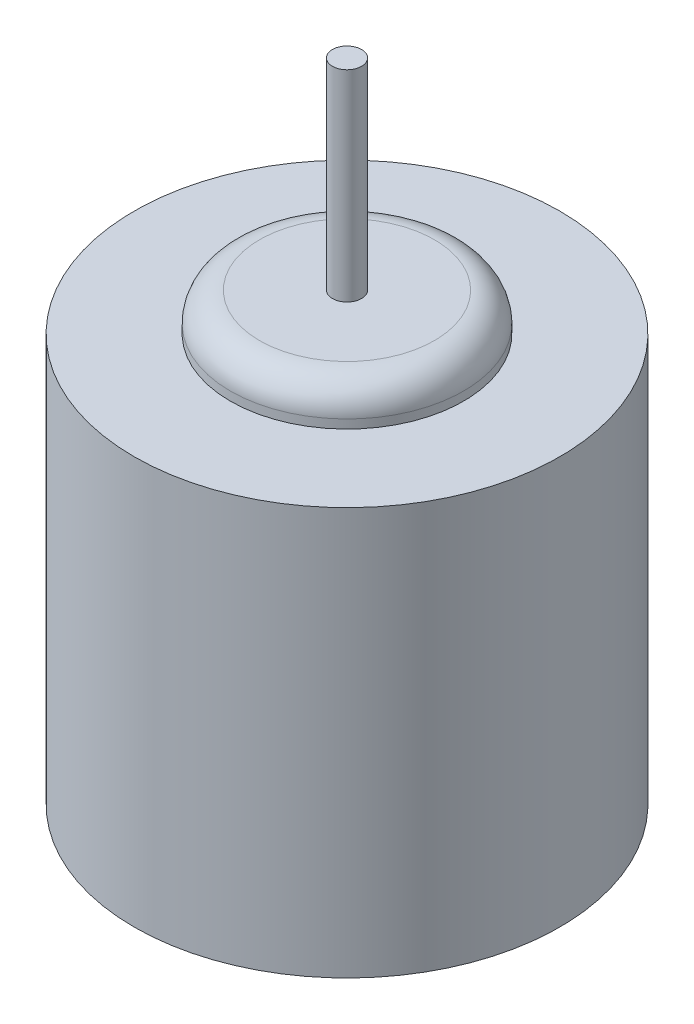
ISO-10303-21;
HEADER;
FILE_DESCRIPTION(('STEP AP214'),'2;1');
FILE_NAME('part.step','',(''),(''),'','','');
FILE_SCHEMA(('AUTOMOTIVE_DESIGN { 1 0 10303 214 1 1 1 1 }'));
ENDSEC;
DATA;
#1=APPLICATION_CONTEXT('core data for automotive mechanical design processes');
#2=APPLICATION_PROTOCOL_DEFINITION('international standard','automotive_design',2000,#1);
#3=PRODUCT_CONTEXT('',#1,'mechanical');
#4=PRODUCT('Part','Part','',(#3));
#5=PRODUCT_RELATED_PRODUCT_CATEGORY('part','',(#4));
#6=PRODUCT_DEFINITION_FORMATION('','',#4);
#7=PRODUCT_DEFINITION_CONTEXT('part definition',#1,'design');
#8=PRODUCT_DEFINITION('design','',#6,#7);
#9=PRODUCT_DEFINITION_SHAPE('','',#8);
#10=(LENGTH_UNIT() NAMED_UNIT(*) SI_UNIT(.MILLI.,.METRE.));
#11=(NAMED_UNIT(*) PLANE_ANGLE_UNIT() SI_UNIT($,.RADIAN.));
#12=(NAMED_UNIT(*) SI_UNIT($,.STERADIAN.) SOLID_ANGLE_UNIT());
#13=UNCERTAINTY_MEASURE_WITH_UNIT(LENGTH_MEASURE(1.E-05),#10,'distance_accuracy_value','');
#14=(GEOMETRIC_REPRESENTATION_CONTEXT(3) GLOBAL_UNCERTAINTY_ASSIGNED_CONTEXT((#13)) GLOBAL_UNIT_ASSIGNED_CONTEXT((#10,
#11,#12)) REPRESENTATION_CONTEXT('',''));
#15=CARTESIAN_POINT('',(0.,0.,0.));
#16=DIRECTION('',(0.,0.,1.));
#17=DIRECTION('',(1.,0.,0.));
#18=AXIS2_PLACEMENT_3D('',#15,#16,#17);
#19=CARTESIAN_POINT('',(0.,27.95,0.));
#20=DIRECTION('',(0.,-1.,0.));
#21=DIRECTION('',(0.,0.,-1.));
#22=AXIS2_PLACEMENT_3D('',#19,#20,#21);
#23=CYLINDRICAL_SURFACE('',#22,14.6);
#24=CARTESIAN_POINT('',(0.,27.95,0.));
#25=DIRECTION('',(0.,1.,0.));
#26=DIRECTION('',(0.,0.,1.));
#27=AXIS2_PLACEMENT_3D('',#24,#25,#26);
#28=CIRCLE('',#27,14.6);
#29=CARTESIAN_POINT('',(0.,27.95,14.6));
#30=VERTEX_POINT('',#29);
#31=EDGE_CURVE('E45',#30,#30,#28,.T.);
#32=ORIENTED_EDGE('',*,*,#31,.F.);
#33=EDGE_LOOP('',(#32));
#34=FACE_BOUND('',#33,.T.);
#35=CARTESIAN_POINT('',(0.,0.,0.));
#36=DIRECTION('',(0.,1.,0.));
#37=DIRECTION('',(0.,0.,1.));
#38=AXIS2_PLACEMENT_3D('',#35,#36,#37);
#39=CIRCLE('',#38,14.6);
#40=CARTESIAN_POINT('',(0.,0.,14.6));
#41=VERTEX_POINT('',#40);
#42=EDGE_CURVE('E48',#41,#41,#39,.T.);
#43=ORIENTED_EDGE('',*,*,#42,.T.);
#44=EDGE_LOOP('',(#43));
#45=FACE_BOUND('',#44,.T.);
#46=ADVANCED_FACE('F30',(#34,#45),#23,.T.);
#47=CARTESIAN_POINT('',(0.,27.95,0.));
#48=DIRECTION('',(0.,1.,0.));
#49=DIRECTION('',(0.,0.,1.));
#50=AXIS2_PLACEMENT_3D('',#47,#48,#49);
#51=PLANE('',#50);
#52=CARTESIAN_POINT('',(0.,27.95,0.));
#53=DIRECTION('',(0.,1.,0.));
#54=DIRECTION('',(0.,0.,1.));
#55=AXIS2_PLACEMENT_3D('',#52,#53,#54);
#56=CIRCLE('',#55,8.);
#57=CARTESIAN_POINT('',(0.,27.95,8.));
#58=VERTEX_POINT('',#57);
#59=EDGE_CURVE('E41',#58,#58,#56,.T.);
#60=ORIENTED_EDGE('',*,*,#59,.F.);
#61=EDGE_LOOP('',(#60));
#62=FACE_BOUND('',#61,.T.);
#63=ORIENTED_EDGE('',*,*,#31,.T.);
#64=EDGE_LOOP('',(#63));
#65=FACE_BOUND('',#64,.T.);
#66=ADVANCED_FACE('F80',(#62,#65),#51,.T.);
#67=CARTESIAN_POINT('',(0.,0.,0.));
#68=DIRECTION('',(0.,1.,0.));
#69=DIRECTION('',(0.,0.,1.));
#70=AXIS2_PLACEMENT_3D('',#67,#68,#69);
#71=PLANE('',#70);
#72=ORIENTED_EDGE('',*,*,#42,.F.);
#73=EDGE_LOOP('',(#72));
#74=FACE_BOUND('',#73,.T.);
#75=ADVANCED_FACE('F77',(#74),#71,.F.);
#76=CARTESIAN_POINT('',(0.,30.55,0.));
#77=DIRECTION('',(0.,-1.,0.));
#78=DIRECTION('',(0.,0.,-1.));
#79=AXIS2_PLACEMENT_3D('',#76,#77,#78);
#80=CYLINDRICAL_SURFACE('',#79,8.);
#81=CARTESIAN_POINT('',(0.,28.55,0.));
#82=DIRECTION('',(0.,1.,0.));
#83=DIRECTION('',(0.,0.,1.));
#84=AXIS2_PLACEMENT_3D('',#81,#82,#83);
#85=CIRCLE('',#84,8.);
#86=CARTESIAN_POINT('',(0.,28.55,8.));
#87=VERTEX_POINT('',#86);
#88=EDGE_CURVE('E10',#87,#87,#85,.F.);
#89=ORIENTED_EDGE('',*,*,#88,.T.);
#90=EDGE_LOOP('',(#89));
#91=FACE_BOUND('',#90,.T.);
#92=ORIENTED_EDGE('',*,*,#59,.T.);
#93=EDGE_LOOP('',(#92));
#94=FACE_BOUND('',#93,.T.);
#95=ADVANCED_FACE('F70',(#91,#94),#80,.T.);
#96=CARTESIAN_POINT('',(0.,30.55,0.));
#97=DIRECTION('',(0.,1.,0.));
#98=DIRECTION('',(0.,0.,1.));
#99=AXIS2_PLACEMENT_3D('',#96,#97,#98);
#100=PLANE('',#99);
#101=CARTESIAN_POINT('',(0.,30.55,0.));
#102=DIRECTION('',(0.,1.,0.));
#103=DIRECTION('',(0.,0.,1.));
#104=AXIS2_PLACEMENT_3D('',#101,#102,#103);
#105=CIRCLE('',#104,1.);
#106=CARTESIAN_POINT('',(0.,30.55,-1.));
#107=VERTEX_POINT('',#106);
#108=EDGE_CURVE('E54',#107,#107,#105,.T.);
#109=ORIENTED_EDGE('',*,*,#108,.F.);
#110=EDGE_LOOP('',(#109));
#111=FACE_BOUND('',#110,.T.);
#112=CARTESIAN_POINT('',(0.,30.55,0.));
#113=DIRECTION('',(0.,1.,0.));
#114=DIRECTION('',(0.,0.,1.));
#115=AXIS2_PLACEMENT_3D('',#112,#113,#114);
#116=CIRCLE('',#115,6.);
#117=CARTESIAN_POINT('',(0.,30.55,6.));
#118=VERTEX_POINT('',#117);
#119=EDGE_CURVE('E37',#118,#118,#116,.T.);
#120=ORIENTED_EDGE('',*,*,#119,.T.);
#121=EDGE_LOOP('',(#120));
#122=FACE_BOUND('',#121,.T.);
#123=ADVANCED_FACE('F68',(#111,#122),#100,.T.);
#124=CARTESIAN_POINT('',(0.,28.55,0.));
#125=DIRECTION('',(0.,1.,0.));
#126=DIRECTION('',(0.,0.,1.));
#127=AXIS2_PLACEMENT_3D('',#124,#125,#126);
#128=TOROIDAL_SURFACE('',#127,6.,2.);
#129=ORIENTED_EDGE('',*,*,#88,.F.);
#130=EDGE_LOOP('',(#129));
#131=FACE_BOUND('',#130,.T.);
#132=ORIENTED_EDGE('',*,*,#119,.F.);
#133=EDGE_LOOP('',(#132));
#134=FACE_BOUND('',#133,.T.);
#135=ADVANCED_FACE('F32',(#131,#134),#128,.T.);
#136=CARTESIAN_POINT('',(0.,44.35,0.));
#137=DIRECTION('',(0.,-1.,0.));
#138=DIRECTION('',(0.,0.,-1.));
#139=AXIS2_PLACEMENT_3D('',#136,#137,#138);
#140=CYLINDRICAL_SURFACE('',#139,1.);
#141=CARTESIAN_POINT('',(0.,44.35,0.));
#142=DIRECTION('',(0.,1.,0.));
#143=DIRECTION('',(0.,0.,1.));
#144=AXIS2_PLACEMENT_3D('',#141,#142,#143);
#145=CIRCLE('',#144,1.);
#146=CARTESIAN_POINT('',(0.,44.35,-1.));
#147=VERTEX_POINT('',#146);
#148=EDGE_CURVE('E51',#147,#147,#145,.T.);
#149=CARTESIAN_POINT('',(0.,44.35,-1.));
#150=CARTESIAN_POINT('',(0.,44.20625,-1.));
#151=CARTESIAN_POINT('',(0.,44.0625,-1.));
#152=CARTESIAN_POINT('',(0.,43.775,-1.));
#153=CARTESIAN_POINT('',(0.,43.63125,-1.));
#154=CARTESIAN_POINT('',(0.,43.34375,-1.));
#155=CARTESIAN_POINT('',(0.,43.2,-1.));
#156=CARTESIAN_POINT('',(0.,42.9125,-1.));
#157=CARTESIAN_POINT('',(0.,42.76875,-1.));
#158=CARTESIAN_POINT('',(0.,42.48125,-1.));
#159=CARTESIAN_POINT('',(0.,42.3375,-1.));
#160=CARTESIAN_POINT('',(0.,42.05,-1.));
#161=CARTESIAN_POINT('',(0.,41.90625,-1.));
#162=CARTESIAN_POINT('',(0.,41.61875,-1.));
#163=CARTESIAN_POINT('',(0.,41.475,-1.));
#164=CARTESIAN_POINT('',(0.,41.1875,-1.));
#165=CARTESIAN_POINT('',(0.,41.04375,-1.));
#166=CARTESIAN_POINT('',(0.,40.75625,-1.));
#167=CARTESIAN_POINT('',(0.,40.6125,-1.));
#168=CARTESIAN_POINT('',(0.,40.325,-1.));
#169=CARTESIAN_POINT('',(0.,40.18125,-1.));
#170=CARTESIAN_POINT('',(0.,39.89375,-1.));
#171=CARTESIAN_POINT('',(0.,39.75,-1.));
#172=CARTESIAN_POINT('',(0.,39.4625,-1.));
#173=CARTESIAN_POINT('',(0.,39.31875,-1.));
#174=CARTESIAN_POINT('',(0.,39.03125,-1.));
#175=CARTESIAN_POINT('',(0.,38.8875,-1.));
#176=CARTESIAN_POINT('',(0.,38.6,-1.));
#177=CARTESIAN_POINT('',(0.,38.45625,-1.));
#178=CARTESIAN_POINT('',(0.,38.16875,-1.));
#179=CARTESIAN_POINT('',(0.,38.025,-1.));
#180=CARTESIAN_POINT('',(0.,37.7375,-1.));
#181=CARTESIAN_POINT('',(0.,37.59375,-1.));
#182=CARTESIAN_POINT('',(0.,37.30625,-1.));
#183=CARTESIAN_POINT('',(0.,37.1625,-1.));
#184=CARTESIAN_POINT('',(0.,36.875,-1.));
#185=CARTESIAN_POINT('',(0.,36.73125,-1.));
#186=CARTESIAN_POINT('',(0.,36.44375,-1.));
#187=CARTESIAN_POINT('',(0.,36.3,-1.));
#188=CARTESIAN_POINT('',(0.,36.0125,-1.));
#189=CARTESIAN_POINT('',(0.,35.86875,-1.));
#190=CARTESIAN_POINT('',(0.,35.58125,-1.));
#191=CARTESIAN_POINT('',(0.,35.4375,-1.));
#192=CARTESIAN_POINT('',(0.,35.15,-1.));
#193=CARTESIAN_POINT('',(0.,35.00625,-1.));
#194=CARTESIAN_POINT('',(0.,34.71875,-1.));
#195=CARTESIAN_POINT('',(0.,34.575,-1.));
#196=CARTESIAN_POINT('',(0.,34.2875,-1.));
#197=CARTESIAN_POINT('',(0.,34.14375,-1.));
#198=CARTESIAN_POINT('',(0.,33.85625,-1.));
#199=CARTESIAN_POINT('',(0.,33.7125,-1.));
#200=CARTESIAN_POINT('',(0.,33.425,-1.));
#201=CARTESIAN_POINT('',(0.,33.28125,-1.));
#202=CARTESIAN_POINT('',(0.,32.99375,-1.));
#203=CARTESIAN_POINT('',(0.,32.85,-1.));
#204=CARTESIAN_POINT('',(0.,32.5625,-1.));
#205=CARTESIAN_POINT('',(0.,32.41875,-1.));
#206=CARTESIAN_POINT('',(0.,32.13125,-1.));
#207=CARTESIAN_POINT('',(0.,31.9875,-1.));
#208=CARTESIAN_POINT('',(0.,31.7,-1.));
#209=CARTESIAN_POINT('',(0.,31.55625,-1.));
#210=CARTESIAN_POINT('',(0.,31.26875,-1.));
#211=CARTESIAN_POINT('',(0.,31.125,-1.));
#212=CARTESIAN_POINT('',(0.,30.8375,-1.));
#213=CARTESIAN_POINT('',(0.,30.69375,-1.));
#214=CARTESIAN_POINT('',(0.,30.55,-1.));
#215=B_SPLINE_CURVE_WITH_KNOTS('',3,(#149,#150,#151,#152,#153,#154,#155,#156,#157,#158,#159,
#160,#161,#162,#163,#164,#165,#166,#167,#168,#169,#170,#171,#172,#173,#174,#175,#176,#177,#178,
#179,#180,#181,#182,#183,#184,#185,#186,#187,#188,#189,#190,#191,#192,#193,#194,#195,#196,#197,
#198,#199,#200,#201,#202,#203,#204,#205,#206,#207,#208,#209,#210,#211,#212,#213,#214),
.UNSPECIFIED.,.F.,.F.,(4,2,2,2,2,2,2,2,2,2,2,2,2,2,2,2,2,2,2,2,2,2,2,2,2,2,2,2,2,2,2,2,4),(0.,
0.431249999999994,0.862499999999995,1.29375,1.725,2.15625,2.5875,3.01874999999999,
3.44999999999999,3.88125,4.3125,4.74375,5.17499999999999,5.60624999999999,6.03749999999999,
6.46875,6.9,7.33125,7.7625,8.19374999999999,8.62499999999999,9.05625,9.4875,9.91875,10.35,
10.78125,11.2125,11.64375,12.075,12.50625,12.9375,13.36875,13.8),.UNSPECIFIED.);
#216=EDGE_CURVE('BSEAM62',#147,#107,#215,.T.);
#217=ORIENTED_EDGE('',*,*,#148,.F.);
#218=ORIENTED_EDGE('',*,*,#108,.T.);
#219=ORIENTED_EDGE('',*,*,#216,.T.);
#220=ORIENTED_EDGE('',*,*,#216,.F.);
#221=EDGE_LOOP('',(#217,#219,#218,#220));
#222=FACE_BOUND('',#221,.T.);
#223=ADVANCED_FACE('F62',(#222),#140,.T.);
#224=CARTESIAN_POINT('',(0.,44.35,0.));
#225=DIRECTION('',(0.,1.,0.));
#226=DIRECTION('',(0.,0.,1.));
#227=AXIS2_PLACEMENT_3D('',#224,#225,#226);
#228=PLANE('',#227);
#229=ORIENTED_EDGE('',*,*,#148,.T.);
#230=EDGE_LOOP('',(#229));
#231=FACE_BOUND('',#230,.T.);
#232=ADVANCED_FACE('F60',(#231),#228,.T.);
#233=CLOSED_SHELL('',(#46,#66,#75,#95,#123,#135,#223,#232));
#234=MANIFOLD_SOLID_BREP('B2',#233);
#235=ADVANCED_BREP_SHAPE_REPRESENTATION('',(#18,#234),#14);
#236=SHAPE_DEFINITION_REPRESENTATION(#9,#235);
ENDSEC;
END-ISO-10303-21;
